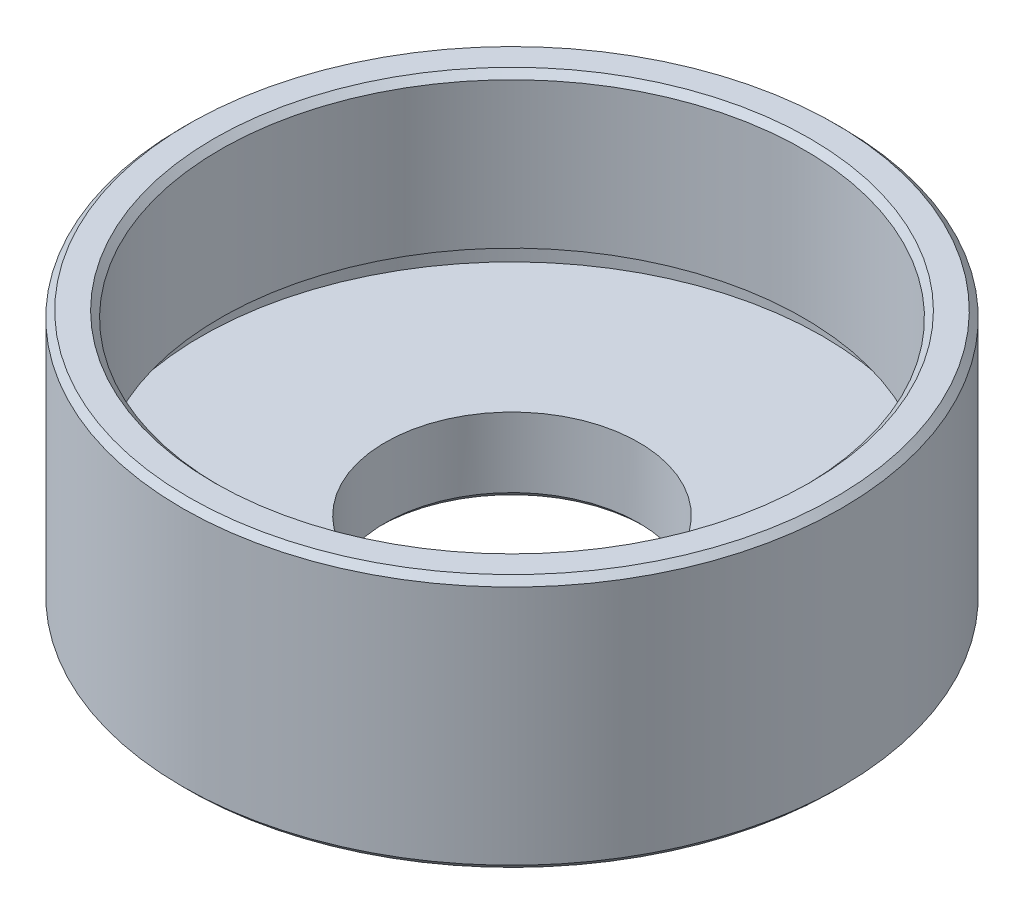
ISO-10303-21;
HEADER;
FILE_DESCRIPTION(('STEP AP214'),'2;1');
FILE_NAME('part.step','',(''),(''),'','','');
FILE_SCHEMA(('AUTOMOTIVE_DESIGN { 1 0 10303 214 1 1 1 1 }'));
ENDSEC;
DATA;
#1=APPLICATION_CONTEXT('core data for automotive mechanical design processes');
#2=APPLICATION_PROTOCOL_DEFINITION('international standard','automotive_design',2000,#1);
#3=PRODUCT_CONTEXT('',#1,'mechanical');
#4=PRODUCT('Part','Part','',(#3));
#5=PRODUCT_RELATED_PRODUCT_CATEGORY('part','',(#4));
#6=PRODUCT_DEFINITION_FORMATION('','',#4);
#7=PRODUCT_DEFINITION_CONTEXT('part definition',#1,'design');
#8=PRODUCT_DEFINITION('design','',#6,#7);
#9=PRODUCT_DEFINITION_SHAPE('','',#8);
#10=(LENGTH_UNIT() NAMED_UNIT(*) SI_UNIT(.MILLI.,.METRE.));
#11=(NAMED_UNIT(*) PLANE_ANGLE_UNIT() SI_UNIT($,.RADIAN.));
#12=(NAMED_UNIT(*) SI_UNIT($,.STERADIAN.) SOLID_ANGLE_UNIT());
#13=UNCERTAINTY_MEASURE_WITH_UNIT(LENGTH_MEASURE(1.E-05),#10,'distance_accuracy_value','');
#14=(GEOMETRIC_REPRESENTATION_CONTEXT(3) GLOBAL_UNCERTAINTY_ASSIGNED_CONTEXT((#13)) GLOBAL_UNIT_ASSIGNED_CONTEXT((#10,
#11,#12)) REPRESENTATION_CONTEXT('',''));
#15=CARTESIAN_POINT('',(0.,0.,0.));
#16=DIRECTION('',(0.,0.,1.));
#17=DIRECTION('',(1.,0.,0.));
#18=AXIS2_PLACEMENT_3D('',#15,#16,#17);
#19=CARTESIAN_POINT('',(23.,20.,-1.60608141586784E-13));
#20=DIRECTION('',(0.,1.,0.));
#21=DIRECTION('',(0.,0.,1.));
#22=AXIS2_PLACEMENT_3D('',#19,#20,#21);
#23=PLANE('',#22);
#24=CARTESIAN_POINT('',(0.,20.,0.));
#25=DIRECTION('',(0.,1.,0.));
#26=DIRECTION('',(0.,0.,1.));
#27=AXIS2_PLACEMENT_3D('',#24,#25,#26);
#28=CIRCLE('',#27,25.5);
#29=CARTESIAN_POINT('',(0.,20.,25.5));
#30=VERTEX_POINT('',#29);
#31=EDGE_CURVE('E42',#30,#30,#28,.T.);
#32=ORIENTED_EDGE('',*,*,#31,.T.);
#33=EDGE_LOOP('',(#32));
#34=FACE_BOUND('',#33,.T.);
#35=CARTESIAN_POINT('',(0.,20.,0.));
#36=DIRECTION('',(0.,1.,0.));
#37=DIRECTION('',(0.,0.,1.));
#38=AXIS2_PLACEMENT_3D('',#35,#36,#37);
#39=CIRCLE('',#38,23.5);
#40=CARTESIAN_POINT('',(0.,20.,23.5));
#41=VERTEX_POINT('',#40);
#42=EDGE_CURVE('E46',#41,#41,#39,.F.);
#43=ORIENTED_EDGE('',*,*,#42,.T.);
#44=EDGE_LOOP('',(#43));
#45=FACE_BOUND('',#44,.T.);
#46=ADVANCED_FACE('F35',(#34,#45),#23,.T.);
#47=CARTESIAN_POINT('',(0.,26.1689859870494,0.));
#48=DIRECTION('',(0.,1.,0.));
#49=DIRECTION('',(0.,0.,1.));
#50=AXIS2_PLACEMENT_3D('',#47,#48,#49);
#51=CYLINDRICAL_SURFACE('',#50,26.);
#52=CARTESIAN_POINT('',(0.,0.500000000000014,0.));
#53=DIRECTION('',(0.,-1.,0.));
#54=DIRECTION('',(0.,0.,-1.));
#55=AXIS2_PLACEMENT_3D('',#52,#53,#54);
#56=CIRCLE('',#55,26.);
#57=CARTESIAN_POINT('',(0.,0.500000000000014,-26.));
#58=VERTEX_POINT('',#57);
#59=EDGE_CURVE('E50',#58,#58,#56,.F.);
#60=ORIENTED_EDGE('',*,*,#59,.T.);
#61=EDGE_LOOP('',(#60));
#62=FACE_BOUND('',#61,.T.);
#63=CARTESIAN_POINT('',(0.,19.5,0.));
#64=DIRECTION('',(0.,1.,0.));
#65=DIRECTION('',(0.,0.,1.));
#66=AXIS2_PLACEMENT_3D('',#63,#64,#65);
#67=CIRCLE('',#66,26.);
#68=CARTESIAN_POINT('',(0.,19.5,26.));
#69=VERTEX_POINT('',#68);
#70=EDGE_CURVE('E55',#69,#69,#67,.F.);
#71=ORIENTED_EDGE('',*,*,#70,.T.);
#72=EDGE_LOOP('',(#71));
#73=FACE_BOUND('',#72,.T.);
#74=ADVANCED_FACE('F97',(#62,#73),#51,.T.);
#75=CARTESIAN_POINT('',(26.,0.,-1.81557029619843E-13));
#76=DIRECTION('',(0.,-1.,0.));
#77=DIRECTION('',(0.,0.,-1.));
#78=AXIS2_PLACEMENT_3D('',#75,#76,#77);
#79=PLANE('',#78);
#80=CARTESIAN_POINT('',(0.,0.,0.));
#81=DIRECTION('',(0.,-1.,0.));
#82=DIRECTION('',(0.,0.,-1.));
#83=AXIS2_PLACEMENT_3D('',#80,#81,#82);
#84=CIRCLE('',#83,10.5);
#85=CARTESIAN_POINT('',(0.,0.,-10.5));
#86=VERTEX_POINT('',#85);
#87=EDGE_CURVE('E61',#86,#86,#84,.F.);
#88=ORIENTED_EDGE('',*,*,#87,.T.);
#89=EDGE_LOOP('',(#88));
#90=FACE_BOUND('',#89,.T.);
#91=CARTESIAN_POINT('',(0.,0.,0.));
#92=DIRECTION('',(0.,-1.,0.));
#93=DIRECTION('',(0.,0.,-1.));
#94=AXIS2_PLACEMENT_3D('',#91,#92,#93);
#95=CIRCLE('',#94,25.5);
#96=CARTESIAN_POINT('',(0.,0.,-25.5));
#97=VERTEX_POINT('',#96);
#98=EDGE_CURVE('E64',#97,#97,#95,.T.);
#99=ORIENTED_EDGE('',*,*,#98,.T.);
#100=EDGE_LOOP('',(#99));
#101=FACE_BOUND('',#100,.T.);
#102=ADVANCED_FACE('F102',(#90,#101),#79,.T.);
#103=CARTESIAN_POINT('',(0.,26.1689859870494,0.));
#104=DIRECTION('',(0.,1.,0.));
#105=DIRECTION('',(0.,0.,1.));
#106=AXIS2_PLACEMENT_3D('',#103,#104,#105);
#107=CYLINDRICAL_SURFACE('',#106,9.99999999999999);
#108=CARTESIAN_POINT('',(0.,0.5,0.));
#109=DIRECTION('',(0.,-1.,0.));
#110=DIRECTION('',(0.,0.,-1.));
#111=AXIS2_PLACEMENT_3D('',#108,#109,#110);
#112=CIRCLE('',#111,9.99999999999999);
#113=CARTESIAN_POINT('',(0.,0.5,-9.99999999999999));
#114=VERTEX_POINT('',#113);
#115=EDGE_CURVE('E58',#114,#114,#112,.T.);
#116=ORIENTED_EDGE('',*,*,#115,.T.);
#117=EDGE_LOOP('',(#116));
#118=FACE_BOUND('',#117,.T.);
#119=CARTESIAN_POINT('',(0.,6.,0.));
#120=DIRECTION('',(0.,1.,0.));
#121=DIRECTION('',(0.,0.,1.));
#122=AXIS2_PLACEMENT_3D('',#119,#120,#121);
#123=CIRCLE('',#122,9.99999999999999);
#124=CARTESIAN_POINT('',(0.,6.,9.99999999999999));
#125=VERTEX_POINT('',#124);
#126=EDGE_CURVE('E67',#125,#125,#123,.T.);
#127=ORIENTED_EDGE('',*,*,#126,.T.);
#128=EDGE_LOOP('',(#127));
#129=FACE_BOUND('',#128,.T.);
#130=ADVANCED_FACE('F153',(#118,#129),#107,.F.);
#131=CARTESIAN_POINT('',(9.99999999999999,6.,0.));
#132=DIRECTION('',(0.,1.,0.));
#133=DIRECTION('',(0.,0.,1.));
#134=AXIS2_PLACEMENT_3D('',#131,#132,#133);
#135=PLANE('',#134);
#136=CARTESIAN_POINT('',(0.,6.,0.));
#137=DIRECTION('',(0.,1.,0.));
#138=DIRECTION('',(0.,0.,1.));
#139=AXIS2_PLACEMENT_3D('',#136,#137,#138);
#140=CIRCLE('',#139,24.5);
#141=CARTESIAN_POINT('',(0.,6.,24.5));
#142=VERTEX_POINT('',#141);
#143=EDGE_CURVE('E70',#142,#142,#140,.T.);
#144=ORIENTED_EDGE('',*,*,#143,.T.);
#145=EDGE_LOOP('',(#144));
#146=FACE_BOUND('',#145,.T.);
#147=ORIENTED_EDGE('',*,*,#126,.F.);
#148=EDGE_LOOP('',(#147));
#149=FACE_BOUND('',#148,.T.);
#150=ADVANCED_FACE('F158',(#146,#149),#135,.T.);
#151=CARTESIAN_POINT('',(0.,26.1689859870494,0.));
#152=DIRECTION('',(0.,1.,0.));
#153=DIRECTION('',(0.,0.,1.));
#154=AXIS2_PLACEMENT_3D('',#151,#152,#153);
#155=CYLINDRICAL_SURFACE('',#154,24.5);
#156=CARTESIAN_POINT('',(0.,8.,0.));
#157=DIRECTION('',(0.,1.,0.));
#158=DIRECTION('',(0.,0.,1.));
#159=AXIS2_PLACEMENT_3D('',#156,#157,#158);
#160=CIRCLE('',#159,24.5);
#161=CARTESIAN_POINT('',(0.,8.,24.5));
#162=VERTEX_POINT('',#161);
#163=EDGE_CURVE('E73',#162,#162,#160,.T.);
#164=ORIENTED_EDGE('',*,*,#163,.T.);
#165=EDGE_LOOP('',(#164));
#166=FACE_BOUND('',#165,.T.);
#167=ORIENTED_EDGE('',*,*,#143,.F.);
#168=EDGE_LOOP('',(#167));
#169=FACE_BOUND('',#168,.T.);
#170=ADVANCED_FACE('F94',(#166,#169),#155,.F.);
#171=CARTESIAN_POINT('',(24.5,8.,-1.71082585603314E-13));
#172=DIRECTION('',(0.,-1.,0.));
#173=DIRECTION('',(0.,0.,-1.));
#174=AXIS2_PLACEMENT_3D('',#171,#172,#173);
#175=PLANE('',#174);
#176=CARTESIAN_POINT('',(0.,8.,0.));
#177=DIRECTION('',(0.,1.,0.));
#178=DIRECTION('',(0.,0.,1.));
#179=AXIS2_PLACEMENT_3D('',#176,#177,#178);
#180=CIRCLE('',#179,23.);
#181=CARTESIAN_POINT('',(0.,8.,23.));
#182=VERTEX_POINT('',#181);
#183=EDGE_CURVE('E76',#182,#182,#180,.T.);
#184=ORIENTED_EDGE('',*,*,#183,.T.);
#185=EDGE_LOOP('',(#184));
#186=FACE_BOUND('',#185,.T.);
#187=ORIENTED_EDGE('',*,*,#163,.F.);
#188=EDGE_LOOP('',(#187));
#189=FACE_BOUND('',#188,.T.);
#190=ADVANCED_FACE('F80',(#186,#189),#175,.T.);
#191=CARTESIAN_POINT('',(0.,26.1689859870494,0.));
#192=DIRECTION('',(0.,1.,0.));
#193=DIRECTION('',(0.,0.,1.));
#194=AXIS2_PLACEMENT_3D('',#191,#192,#193);
#195=CYLINDRICAL_SURFACE('',#194,23.);
#196=CARTESIAN_POINT('',(0.,19.5,0.));
#197=DIRECTION('',(0.,1.,0.));
#198=DIRECTION('',(0.,0.,1.));
#199=AXIS2_PLACEMENT_3D('',#196,#197,#198);
#200=CIRCLE('',#199,23.);
#201=CARTESIAN_POINT('',(0.,19.5,23.));
#202=VERTEX_POINT('',#201);
#203=EDGE_CURVE('E10',#202,#202,#200,.T.);
#204=ORIENTED_EDGE('',*,*,#203,.T.);
#205=EDGE_LOOP('',(#204));
#206=FACE_BOUND('',#205,.T.);
#207=ORIENTED_EDGE('',*,*,#183,.F.);
#208=EDGE_LOOP('',(#207));
#209=FACE_BOUND('',#208,.T.);
#210=ADVANCED_FACE('F83',(#206,#209),#195,.F.);
#211=CARTESIAN_POINT('',(0.,0.,0.));
#212=DIRECTION('',(0.,-1.,0.));
#213=DIRECTION('',(0.,0.,-1.));
#214=AXIS2_PLACEMENT_3D('',#211,#212,#213);
#215=CONICAL_SURFACE('',#214,10.5,0.785398163397441);
#216=ORIENTED_EDGE('',*,*,#115,.F.);
#217=EDGE_LOOP('',(#216));
#218=FACE_BOUND('',#217,.T.);
#219=ORIENTED_EDGE('',*,*,#87,.F.);
#220=EDGE_LOOP('',(#219));
#221=FACE_BOUND('',#220,.T.);
#222=ADVANCED_FACE('F85',(#218,#221),#215,.F.);
#223=CARTESIAN_POINT('',(0.,0.500000000000014,0.));
#224=DIRECTION('',(0.,1.,0.));
#225=DIRECTION('',(0.,0.,1.));
#226=AXIS2_PLACEMENT_3D('',#223,#224,#225);
#227=CONICAL_SURFACE('',#226,26.,0.785398163397448);
#228=ORIENTED_EDGE('',*,*,#98,.F.);
#229=EDGE_LOOP('',(#228));
#230=FACE_BOUND('',#229,.T.);
#231=ORIENTED_EDGE('',*,*,#59,.F.);
#232=EDGE_LOOP('',(#231));
#233=FACE_BOUND('',#232,.T.);
#234=ADVANCED_FACE('F91',(#230,#233),#227,.T.);
#235=CARTESIAN_POINT('',(0.,20.,0.));
#236=DIRECTION('',(0.,-1.,0.));
#237=DIRECTION('',(0.,0.,-1.));
#238=AXIS2_PLACEMENT_3D('',#235,#236,#237);
#239=CONICAL_SURFACE('',#238,25.5,0.785398163397448);
#240=ORIENTED_EDGE('',*,*,#70,.F.);
#241=EDGE_LOOP('',(#240));
#242=FACE_BOUND('',#241,.T.);
#243=ORIENTED_EDGE('',*,*,#31,.F.);
#244=EDGE_LOOP('',(#243));
#245=FACE_BOUND('',#244,.T.);
#246=ADVANCED_FACE('F109',(#242,#245),#239,.T.);
#247=CARTESIAN_POINT('',(0.,19.5,0.));
#248=DIRECTION('',(0.,1.,0.));
#249=DIRECTION('',(0.,0.,1.));
#250=AXIS2_PLACEMENT_3D('',#247,#248,#249);
#251=CONICAL_SURFACE('',#250,23.,0.785398163397459);
#252=ORIENTED_EDGE('',*,*,#42,.F.);
#253=EDGE_LOOP('',(#252));
#254=FACE_BOUND('',#253,.T.);
#255=ORIENTED_EDGE('',*,*,#203,.F.);
#256=EDGE_LOOP('',(#255));
#257=FACE_BOUND('',#256,.T.);
#258=ADVANCED_FACE('F37',(#254,#257),#251,.F.);
#259=CLOSED_SHELL('',(#46,#74,#102,#130,#150,#170,#190,#210,#222,#234,#246,#258));
#260=MANIFOLD_SOLID_BREP('B2',#259);
#261=ADVANCED_BREP_SHAPE_REPRESENTATION('',(#18,#260),#14);
#262=SHAPE_DEFINITION_REPRESENTATION(#9,#261);
ENDSEC;
END-ISO-10303-21;
